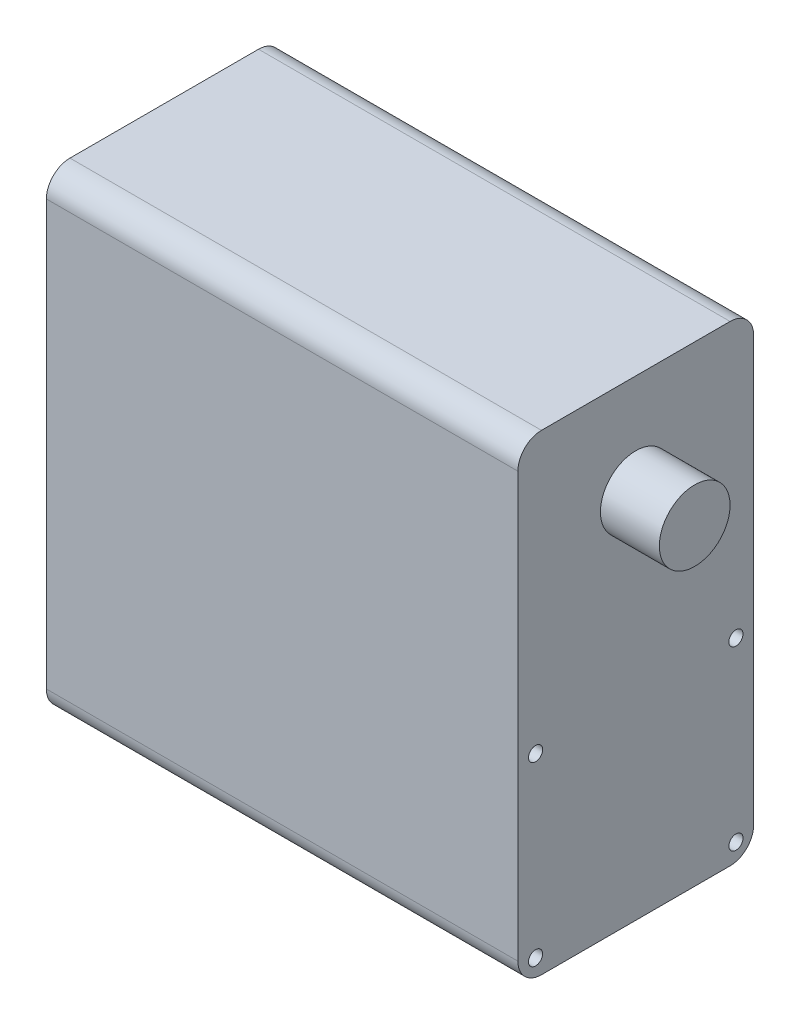
ISO-10303-21;
HEADER;
FILE_DESCRIPTION(('STEP AP214'),'2;1');
FILE_NAME('part.step','',(''),(''),'','','');
FILE_SCHEMA(('AUTOMOTIVE_DESIGN { 1 0 10303 214 1 1 1 1 }'));
ENDSEC;
DATA;
#1=APPLICATION_CONTEXT('core data for automotive mechanical design processes');
#2=APPLICATION_PROTOCOL_DEFINITION('international standard','automotive_design',2000,#1);
#3=PRODUCT_CONTEXT('',#1,'mechanical');
#4=PRODUCT('Part','Part','',(#3));
#5=PRODUCT_RELATED_PRODUCT_CATEGORY('part','',(#4));
#6=PRODUCT_DEFINITION_FORMATION('','',#4);
#7=PRODUCT_DEFINITION_CONTEXT('part definition',#1,'design');
#8=PRODUCT_DEFINITION('design','',#6,#7);
#9=PRODUCT_DEFINITION_SHAPE('','',#8);
#10=(LENGTH_UNIT() NAMED_UNIT(*) SI_UNIT(.MILLI.,.METRE.));
#11=(NAMED_UNIT(*) PLANE_ANGLE_UNIT() SI_UNIT($,.RADIAN.));
#12=(NAMED_UNIT(*) SI_UNIT($,.STERADIAN.) SOLID_ANGLE_UNIT());
#13=UNCERTAINTY_MEASURE_WITH_UNIT(LENGTH_MEASURE(1.E-05),#10,'distance_accuracy_value','');
#14=(GEOMETRIC_REPRESENTATION_CONTEXT(3) GLOBAL_UNCERTAINTY_ASSIGNED_CONTEXT((#13)) GLOBAL_UNIT_ASSIGNED_CONTEXT((#10,
#11,#12)) REPRESENTATION_CONTEXT('',''));
#15=CARTESIAN_POINT('',(0.,0.,0.));
#16=DIRECTION('',(0.,0.,1.));
#17=DIRECTION('',(1.,0.,0.));
#18=AXIS2_PLACEMENT_3D('',#15,#16,#17);
#19=CARTESIAN_POINT('',(0.,0.,0.));
#20=DIRECTION('',(1.,0.,0.));
#21=DIRECTION('',(0.,0.,-1.));
#22=AXIS2_PLACEMENT_3D('',#19,#20,#21);
#23=PLANE('',#22);
#24=CARTESIAN_POINT('',(0.,2.29906463085361,-10.4090018043815));
#25=DIRECTION('',(-1.,0.,0.));
#26=DIRECTION('',(0.,0.,1.));
#27=AXIS2_PLACEMENT_3D('',#24,#25,#26);
#28=CIRCLE('',#27,1.);
#29=CARTESIAN_POINT('',(0.,2.29906463085361,-9.4090018043815));
#30=VERTEX_POINT('',#29);
#31=EDGE_CURVE('E237',#30,#30,#28,.T.);
#32=ORIENTED_EDGE('',*,*,#31,.F.);
#33=EDGE_LOOP('',(#32));
#34=FACE_BOUND('',#33,.T.);
#35=CARTESIAN_POINT('',(0.,-10.7009353691464,-11.4090018043815));
#36=DIRECTION('',(-1.,0.,0.));
#37=DIRECTION('',(0.,0.,1.));
#38=AXIS2_PLACEMENT_3D('',#35,#36,#37);
#39=CIRCLE('',#38,1.);
#40=CARTESIAN_POINT('',(0.,-10.7009353691464,-10.4090018043815));
#41=VERTEX_POINT('',#40);
#42=EDGE_CURVE('E230',#41,#41,#39,.T.);
#43=ORIENTED_EDGE('',*,*,#42,.F.);
#44=EDGE_LOOP('',(#43));
#45=FACE_BOUND('',#44,.T.);
#46=CARTESIAN_POINT('',(0.,-17.2009353691464,-18.4090018043815));
#47=DIRECTION('',(-1.,0.,0.));
#48=DIRECTION('',(0.,0.,1.));
#49=AXIS2_PLACEMENT_3D('',#46,#47,#48);
#50=CIRCLE('',#49,1.);
#51=CARTESIAN_POINT('',(0.,-17.2009353691464,-17.4090018043815));
#52=VERTEX_POINT('',#51);
#53=EDGE_CURVE('E254',#52,#52,#50,.T.);
#54=ORIENTED_EDGE('',*,*,#53,.F.);
#55=EDGE_LOOP('',(#54));
#56=FACE_BOUND('',#55,.T.);
#57=CARTESIAN_POINT('',(0.,-13.7009353691464,-11.4090018043815));
#58=DIRECTION('',(-1.,0.,0.));
#59=DIRECTION('',(0.,0.,1.));
#60=AXIS2_PLACEMENT_3D('',#57,#58,#59);
#61=CIRCLE('',#60,1.);
#62=CARTESIAN_POINT('',(0.,-13.7009353691464,-10.4090018043815));
#63=VERTEX_POINT('',#62);
#64=EDGE_CURVE('E221',#63,#63,#61,.T.);
#65=ORIENTED_EDGE('',*,*,#64,.F.);
#66=EDGE_LOOP('',(#65));
#67=FACE_BOUND('',#66,.T.);
#68=CARTESIAN_POINT('',(0.,11.2990646308536,-18.4090018043815));
#69=DIRECTION('',(1.,0.,0.));
#70=DIRECTION('',(0.,0.,-1.));
#71=AXIS2_PLACEMENT_3D('',#68,#69,#70);
#72=CIRCLE('',#71,3.);
#73=CARTESIAN_POINT('',(0.,11.2990646308536,-21.4090018043815));
#74=VERTEX_POINT('',#73);
#75=EDGE_CURVE('E139',#74,#74,#72,.T.);
#76=ORIENTED_EDGE('',*,*,#75,.T.);
#77=EDGE_LOOP('',(#76));
#78=FACE_BOUND('',#77,.T.);
#79=DIRECTION('',(0.,1.,0.));
#80=VECTOR('',#79,1.);
#81=CARTESIAN_POINT('',(0.,19.7990646308536,-28.4090018043815));
#82=LINE('',#81,#80);
#83=CARTESIAN_POINT('',(0.,-18.2009353691464,-28.4090018043815));
#84=VERTEX_POINT('',#83);
#85=CARTESIAN_POINT('',(0.,17.7990646308536,-28.4090018043815));
#86=VERTEX_POINT('',#85);
#87=EDGE_CURVE('E122',#84,#86,#82,.T.);
#88=ORIENTED_EDGE('',*,*,#87,.F.);
#89=CARTESIAN_POINT('',(0.,-18.2009353691464,-26.4090018043815));
#90=DIRECTION('',(1.,0.,0.));
#91=DIRECTION('',(0.,0.,-1.));
#92=AXIS2_PLACEMENT_3D('',#89,#90,#91);
#93=CIRCLE('',#92,2.);
#94=CARTESIAN_POINT('',(0.,-20.2009353691464,-26.4090018043815));
#95=VERTEX_POINT('',#94);
#96=EDGE_CURVE('E105',#84,#95,#93,.F.);
#97=ORIENTED_EDGE('',*,*,#96,.T.);
#98=DIRECTION('',(0.,0.,-1.));
#99=VECTOR('',#98,1.);
#100=CARTESIAN_POINT('',(0.,-20.2009353691464,-8.40900180438151));
#101=LINE('',#100,#99);
#102=CARTESIAN_POINT('',(0.,-20.2009353691464,-10.4090018043815));
#103=VERTEX_POINT('',#102);
#104=EDGE_CURVE('E131',#103,#95,#101,.T.);
#105=ORIENTED_EDGE('',*,*,#104,.F.);
#106=CARTESIAN_POINT('',(0.,-18.2009353691464,-10.4090018043815));
#107=DIRECTION('',(1.,0.,0.));
#108=DIRECTION('',(0.,0.,-1.));
#109=AXIS2_PLACEMENT_3D('',#106,#107,#108);
#110=CIRCLE('',#109,2.);
#111=CARTESIAN_POINT('',(0.,-18.2009353691464,-8.40900180438151));
#112=VERTEX_POINT('',#111);
#113=EDGE_CURVE('E116',#103,#112,#110,.F.);
#114=ORIENTED_EDGE('',*,*,#113,.T.);
#115=DIRECTION('',(0.,-1.,0.));
#116=VECTOR('',#115,1.);
#117=CARTESIAN_POINT('',(0.,19.7990646308536,-8.4090018043815));
#118=LINE('',#117,#116);
#119=CARTESIAN_POINT('',(0.,17.7990646308536,-8.4090018043815));
#120=VERTEX_POINT('',#119);
#121=EDGE_CURVE('E135',#120,#112,#118,.T.);
#122=ORIENTED_EDGE('',*,*,#121,.F.);
#123=CARTESIAN_POINT('',(0.,17.7990646308536,-10.4090018043815));
#124=DIRECTION('',(1.,0.,0.));
#125=DIRECTION('',(0.,0.,-1.));
#126=AXIS2_PLACEMENT_3D('',#123,#124,#125);
#127=CIRCLE('',#126,2.);
#128=CARTESIAN_POINT('',(0.,19.7990646308536,-10.4090018043815));
#129=VERTEX_POINT('',#128);
#130=EDGE_CURVE('E147',#120,#129,#127,.F.);
#131=ORIENTED_EDGE('',*,*,#130,.T.);
#132=DIRECTION('',(0.,0.,1.));
#133=VECTOR('',#132,1.);
#134=CARTESIAN_POINT('',(0.,19.7990646308536,-8.4090018043815));
#135=LINE('',#134,#133);
#136=CARTESIAN_POINT('',(0.,19.7990646308536,-26.4090018043815));
#137=VERTEX_POINT('',#136);
#138=EDGE_CURVE('E130',#137,#129,#135,.T.);
#139=ORIENTED_EDGE('',*,*,#138,.F.);
#140=CARTESIAN_POINT('',(0.,17.7990646308536,-26.4090018043815));
#141=DIRECTION('',(1.,0.,0.));
#142=DIRECTION('',(0.,0.,-1.));
#143=AXIS2_PLACEMENT_3D('',#140,#141,#142);
#144=CIRCLE('',#143,2.);
#145=EDGE_CURVE('E125',#137,#86,#144,.F.);
#146=ORIENTED_EDGE('',*,*,#145,.T.);
#147=EDGE_LOOP('',(#88,#97,#105,#114,#122,#131,#139,#146));
#148=FACE_BOUND('',#147,.T.);
#149=CARTESIAN_POINT('',(0.,-10.7009353691464,-25.4090018043815));
#150=DIRECTION('',(1.,0.,0.));
#151=DIRECTION('',(0.,0.,-1.));
#152=AXIS2_PLACEMENT_3D('',#149,#150,#151);
#153=CIRCLE('',#152,1.);
#154=CARTESIAN_POINT('',(0.,-10.7009353691464,-26.4090018043815));
#155=VERTEX_POINT('',#154);
#156=EDGE_CURVE('E231',#155,#155,#153,.T.);
#157=ORIENTED_EDGE('',*,*,#156,.T.);
#158=EDGE_LOOP('',(#157));
#159=FACE_BOUND('',#158,.T.);
#160=CARTESIAN_POINT('',(0.,2.29906463085361,-26.4090018043815));
#161=DIRECTION('',(1.,0.,0.));
#162=DIRECTION('',(0.,0.,-1.));
#163=AXIS2_PLACEMENT_3D('',#160,#161,#162);
#164=CIRCLE('',#163,1.);
#165=CARTESIAN_POINT('',(0.,2.29906463085361,-27.4090018043815));
#166=VERTEX_POINT('',#165);
#167=EDGE_CURVE('E243',#166,#166,#164,.T.);
#168=ORIENTED_EDGE('',*,*,#167,.T.);
#169=EDGE_LOOP('',(#168));
#170=FACE_BOUND('',#169,.T.);
#171=CARTESIAN_POINT('',(0.,-13.7009353691464,-25.4090018043815));
#172=DIRECTION('',(-1.,0.,0.));
#173=DIRECTION('',(0.,0.,1.));
#174=AXIS2_PLACEMENT_3D('',#171,#172,#173);
#175=CIRCLE('',#174,1.);
#176=CARTESIAN_POINT('',(0.,-13.7009353691464,-24.4090018043815));
#177=VERTEX_POINT('',#176);
#178=EDGE_CURVE('E224',#177,#177,#175,.F.);
#179=ORIENTED_EDGE('',*,*,#178,.T.);
#180=EDGE_LOOP('',(#179));
#181=FACE_BOUND('',#180,.T.);
#182=ADVANCED_FACE('F40',(#34,#45,#56,#67,#78,#148,#159,#170,#181),#23,.F.);
#183=CARTESIAN_POINT('',(40.,0.,0.));
#184=DIRECTION('',(1.,0.,0.));
#185=DIRECTION('',(0.,0.,-1.));
#186=AXIS2_PLACEMENT_3D('',#183,#184,#185);
#187=PLANE('',#186);
#188=CARTESIAN_POINT('',(40.,11.2990646308536,-18.4090018043815));
#189=DIRECTION('',(1.,0.,0.));
#190=DIRECTION('',(0.,0.,-1.));
#191=AXIS2_PLACEMENT_3D('',#188,#189,#190);
#192=CIRCLE('',#191,3.);
#193=CARTESIAN_POINT('',(40.,11.2990646308536,-21.4090018043815));
#194=VERTEX_POINT('',#193);
#195=EDGE_CURVE('E144',#194,#194,#192,.T.);
#196=ORIENTED_EDGE('',*,*,#195,.F.);
#197=EDGE_LOOP('',(#196));
#198=FACE_BOUND('',#197,.T.);
#199=CARTESIAN_POINT('',(40.,-3.70093536914638,-9.90900180438151));
#200=DIRECTION('',(-1.,0.,0.));
#201=DIRECTION('',(0.,0.,1.));
#202=AXIS2_PLACEMENT_3D('',#199,#200,#201);
#203=CIRCLE('',#202,0.6);
#204=CARTESIAN_POINT('',(40.,-3.70093536914638,-9.30900180438151));
#205=VERTEX_POINT('',#204);
#206=EDGE_CURVE('E205',#205,#205,#203,.T.);
#207=ORIENTED_EDGE('',*,*,#206,.T.);
#208=EDGE_LOOP('',(#207));
#209=FACE_BOUND('',#208,.T.);
#210=CARTESIAN_POINT('',(40.,-3.70093536914638,-26.9090018043815));
#211=DIRECTION('',(1.,0.,0.));
#212=DIRECTION('',(0.,0.,-1.));
#213=AXIS2_PLACEMENT_3D('',#210,#211,#212);
#214=CIRCLE('',#213,0.6);
#215=CARTESIAN_POINT('',(40.,-3.70093536914638,-27.5090018043815));
#216=VERTEX_POINT('',#215);
#217=EDGE_CURVE('E195',#216,#216,#214,.T.);
#218=ORIENTED_EDGE('',*,*,#217,.F.);
#219=EDGE_LOOP('',(#218));
#220=FACE_BOUND('',#219,.T.);
#221=CARTESIAN_POINT('',(40.,-18.7009353691464,-26.9090018043815));
#222=DIRECTION('',(1.,0.,0.));
#223=DIRECTION('',(0.,0.,-1.));
#224=AXIS2_PLACEMENT_3D('',#221,#222,#223);
#225=CIRCLE('',#224,0.6);
#226=CARTESIAN_POINT('',(40.,-18.7009353691464,-27.5090018043815));
#227=VERTEX_POINT('',#226);
#228=EDGE_CURVE('E186',#227,#227,#225,.T.);
#229=ORIENTED_EDGE('',*,*,#228,.F.);
#230=EDGE_LOOP('',(#229));
#231=FACE_BOUND('',#230,.T.);
#232=DIRECTION('',(0.,0.,-1.));
#233=VECTOR('',#232,1.);
#234=CARTESIAN_POINT('',(40.,-20.2009353691464,-8.40900180438151));
#235=LINE('',#234,#233);
#236=CARTESIAN_POINT('',(40.,-20.2009353691464,-10.4090018043815));
#237=VERTEX_POINT('',#236);
#238=CARTESIAN_POINT('',(40.,-20.2009353691464,-26.4090018043815));
#239=VERTEX_POINT('',#238);
#240=EDGE_CURVE('E181',#237,#239,#235,.T.);
#241=ORIENTED_EDGE('',*,*,#240,.T.);
#242=CARTESIAN_POINT('',(40.,-18.2009353691464,-26.4090018043815));
#243=DIRECTION('',(1.,0.,0.));
#244=DIRECTION('',(0.,0.,-1.));
#245=AXIS2_PLACEMENT_3D('',#242,#243,#244);
#246=CIRCLE('',#245,2.);
#247=CARTESIAN_POINT('',(40.,-18.2009353691464,-28.4090018043815));
#248=VERTEX_POINT('',#247);
#249=EDGE_CURVE('E158',#239,#248,#246,.T.);
#250=ORIENTED_EDGE('',*,*,#249,.T.);
#251=DIRECTION('',(0.,1.,0.));
#252=VECTOR('',#251,1.);
#253=CARTESIAN_POINT('',(40.,19.7990646308536,-28.4090018043815));
#254=LINE('',#253,#252);
#255=CARTESIAN_POINT('',(40.,17.7990646308536,-28.4090018043815));
#256=VERTEX_POINT('',#255);
#257=EDGE_CURVE('E124',#248,#256,#254,.T.);
#258=ORIENTED_EDGE('',*,*,#257,.T.);
#259=CARTESIAN_POINT('',(40.,17.7990646308536,-26.4090018043815));
#260=DIRECTION('',(1.,0.,0.));
#261=DIRECTION('',(0.,0.,-1.));
#262=AXIS2_PLACEMENT_3D('',#259,#260,#261);
#263=CIRCLE('',#262,2.);
#264=CARTESIAN_POINT('',(40.,19.7990646308536,-26.4090018043815));
#265=VERTEX_POINT('',#264);
#266=EDGE_CURVE('E60',#256,#265,#263,.T.);
#267=ORIENTED_EDGE('',*,*,#266,.T.);
#268=DIRECTION('',(0.,0.,1.));
#269=VECTOR('',#268,1.);
#270=CARTESIAN_POINT('',(40.,19.7990646308536,-8.4090018043815));
#271=LINE('',#270,#269);
#272=CARTESIAN_POINT('',(40.,19.7990646308536,-10.4090018043815));
#273=VERTEX_POINT('',#272);
#274=EDGE_CURVE('E167',#265,#273,#271,.T.);
#275=ORIENTED_EDGE('',*,*,#274,.T.);
#276=CARTESIAN_POINT('',(40.,17.7990646308536,-10.4090018043815));
#277=DIRECTION('',(1.,0.,0.));
#278=DIRECTION('',(0.,0.,-1.));
#279=AXIS2_PLACEMENT_3D('',#276,#277,#278);
#280=CIRCLE('',#279,2.);
#281=CARTESIAN_POINT('',(40.,17.7990646308536,-8.4090018043815));
#282=VERTEX_POINT('',#281);
#283=EDGE_CURVE('E154',#273,#282,#280,.T.);
#284=ORIENTED_EDGE('',*,*,#283,.T.);
#285=DIRECTION('',(0.,-1.,0.));
#286=VECTOR('',#285,1.);
#287=CARTESIAN_POINT('',(40.,19.7990646308536,-8.4090018043815));
#288=LINE('',#287,#286);
#289=CARTESIAN_POINT('',(40.,-18.2009353691464,-8.40900180438151));
#290=VERTEX_POINT('',#289);
#291=EDGE_CURVE('E133',#282,#290,#288,.T.);
#292=ORIENTED_EDGE('',*,*,#291,.T.);
#293=CARTESIAN_POINT('',(40.,-18.2009353691464,-10.4090018043815));
#294=DIRECTION('',(1.,0.,0.));
#295=DIRECTION('',(0.,0.,-1.));
#296=AXIS2_PLACEMENT_3D('',#293,#294,#295);
#297=CIRCLE('',#296,2.);
#298=EDGE_CURVE('E156',#290,#237,#297,.T.);
#299=ORIENTED_EDGE('',*,*,#298,.T.);
#300=EDGE_LOOP('',(#241,#250,#258,#267,#275,#284,#292,#299));
#301=FACE_BOUND('',#300,.T.);
#302=CARTESIAN_POINT('',(40.,-18.7009353691464,-9.90900180438151));
#303=DIRECTION('',(-1.,0.,0.));
#304=DIRECTION('',(0.,0.,1.));
#305=AXIS2_PLACEMENT_3D('',#302,#303,#304);
#306=CIRCLE('',#305,0.6);
#307=CARTESIAN_POINT('',(40.,-18.7009353691464,-9.30900180438151));
#308=VERTEX_POINT('',#307);
#309=EDGE_CURVE('E199',#308,#308,#306,.T.);
#310=ORIENTED_EDGE('',*,*,#309,.T.);
#311=EDGE_LOOP('',(#310));
#312=FACE_BOUND('',#311,.T.);
#313=ADVANCED_FACE('F281',(#198,#209,#220,#231,#301,#312),#187,.T.);
#314=CARTESIAN_POINT('',(40.,19.7990646308536,-8.4090018043815));
#315=DIRECTION('',(0.,0.,-1.));
#316=DIRECTION('',(0.,1.,0.));
#317=AXIS2_PLACEMENT_3D('',#314,#315,#316);
#318=PLANE('',#317);
#319=ORIENTED_EDGE('',*,*,#121,.T.);
#320=DIRECTION('',(-1.,0.,0.));
#321=VECTOR('',#320,1.);
#322=CARTESIAN_POINT('',(40.,-18.2009353691464,-8.40900180438151));
#323=LINE('',#322,#321);
#324=EDGE_CURVE('E163',#112,#290,#323,.F.);
#325=ORIENTED_EDGE('',*,*,#324,.T.);
#326=ORIENTED_EDGE('',*,*,#291,.F.);
#327=DIRECTION('',(-1.,0.,0.));
#328=VECTOR('',#327,1.);
#329=CARTESIAN_POINT('',(40.,17.7990646308536,-8.4090018043815));
#330=LINE('',#329,#328);
#331=EDGE_CURVE('E160',#282,#120,#330,.T.);
#332=ORIENTED_EDGE('',*,*,#331,.T.);
#333=EDGE_LOOP('',(#319,#325,#326,#332));
#334=FACE_BOUND('',#333,.T.);
#335=ADVANCED_FACE('F177',(#334),#318,.F.);
#336=CARTESIAN_POINT('',(40.,-20.2009353691464,-8.40900180438151));
#337=DIRECTION('',(0.,1.,0.));
#338=DIRECTION('',(0.,0.,1.));
#339=AXIS2_PLACEMENT_3D('',#336,#337,#338);
#340=PLANE('',#339);
#341=ORIENTED_EDGE('',*,*,#104,.T.);
#342=DIRECTION('',(-1.,0.,0.));
#343=VECTOR('',#342,1.);
#344=CARTESIAN_POINT('',(40.,-20.2009353691464,-26.4090018043815));
#345=LINE('',#344,#343);
#346=EDGE_CURVE('E110',#95,#239,#345,.F.);
#347=ORIENTED_EDGE('',*,*,#346,.T.);
#348=ORIENTED_EDGE('',*,*,#240,.F.);
#349=DIRECTION('',(-1.,0.,0.));
#350=VECTOR('',#349,1.);
#351=CARTESIAN_POINT('',(40.,-20.2009353691464,-10.4090018043815));
#352=LINE('',#351,#350);
#353=EDGE_CURVE('E115',#237,#103,#352,.T.);
#354=ORIENTED_EDGE('',*,*,#353,.T.);
#355=EDGE_LOOP('',(#341,#347,#348,#354));
#356=FACE_BOUND('',#355,.T.);
#357=ADVANCED_FACE('F299',(#356),#340,.F.);
#358=CARTESIAN_POINT('',(40.,19.7990646308536,-28.4090018043815));
#359=DIRECTION('',(0.,0.,1.));
#360=DIRECTION('',(0.,-1.,0.));
#361=AXIS2_PLACEMENT_3D('',#358,#359,#360);
#362=PLANE('',#361);
#363=ORIENTED_EDGE('',*,*,#257,.F.);
#364=DIRECTION('',(-1.,0.,0.));
#365=VECTOR('',#364,1.);
#366=CARTESIAN_POINT('',(40.,-18.2009353691464,-28.4090018043815));
#367=LINE('',#366,#365);
#368=EDGE_CURVE('E109',#248,#84,#367,.T.);
#369=ORIENTED_EDGE('',*,*,#368,.T.);
#370=ORIENTED_EDGE('',*,*,#87,.T.);
#371=DIRECTION('',(-1.,0.,0.));
#372=VECTOR('',#371,1.);
#373=CARTESIAN_POINT('',(40.,17.7990646308536,-28.4090018043815));
#374=LINE('',#373,#372);
#375=EDGE_CURVE('E126',#86,#256,#374,.F.);
#376=ORIENTED_EDGE('',*,*,#375,.T.);
#377=EDGE_LOOP('',(#363,#369,#370,#376));
#378=FACE_BOUND('',#377,.T.);
#379=ADVANCED_FACE('F121',(#378),#362,.F.);
#380=CARTESIAN_POINT('',(40.,19.7990646308536,-8.4090018043815));
#381=DIRECTION('',(0.,-1.,0.));
#382=DIRECTION('',(0.,0.,-1.));
#383=AXIS2_PLACEMENT_3D('',#380,#381,#382);
#384=PLANE('',#383);
#385=ORIENTED_EDGE('',*,*,#138,.T.);
#386=DIRECTION('',(-1.,0.,0.));
#387=VECTOR('',#386,1.);
#388=CARTESIAN_POINT('',(40.,19.7990646308536,-10.4090018043815));
#389=LINE('',#388,#387);
#390=EDGE_CURVE('E11',#129,#273,#389,.F.);
#391=ORIENTED_EDGE('',*,*,#390,.T.);
#392=ORIENTED_EDGE('',*,*,#274,.F.);
#393=DIRECTION('',(-1.,0.,0.));
#394=VECTOR('',#393,1.);
#395=CARTESIAN_POINT('',(40.,19.7990646308536,-26.4090018043815));
#396=LINE('',#395,#394);
#397=EDGE_CURVE('E48',#265,#137,#396,.T.);
#398=ORIENTED_EDGE('',*,*,#397,.T.);
#399=EDGE_LOOP('',(#385,#391,#392,#398));
#400=FACE_BOUND('',#399,.T.);
#401=ADVANCED_FACE('F166',(#400),#384,.F.);
#402=CARTESIAN_POINT('',(35.,-18.7009353691464,-26.9090018043815));
#403=DIRECTION('',(1.,0.,0.));
#404=DIRECTION('',(0.,0.,-1.));
#405=AXIS2_PLACEMENT_3D('',#402,#403,#404);
#406=CYLINDRICAL_SURFACE('',#405,0.6);
#407=CARTESIAN_POINT('',(35.,-18.7009353691464,-26.9090018043815));
#408=DIRECTION('',(1.,0.,0.));
#409=DIRECTION('',(0.,0.,-1.));
#410=AXIS2_PLACEMENT_3D('',#407,#408,#409);
#411=CIRCLE('',#410,0.6);
#412=CARTESIAN_POINT('',(35.,-18.7009353691464,-27.5090018043815));
#413=VERTEX_POINT('',#412);
#414=EDGE_CURVE('E190',#413,#413,#411,.T.);
#415=ORIENTED_EDGE('',*,*,#414,.F.);
#416=EDGE_LOOP('',(#415));
#417=FACE_BOUND('',#416,.T.);
#418=ORIENTED_EDGE('',*,*,#228,.T.);
#419=EDGE_LOOP('',(#418));
#420=FACE_BOUND('',#419,.T.);
#421=ADVANCED_FACE('F296',(#417,#420),#406,.F.);
#422=CARTESIAN_POINT('',(35.,-18.7009353691464,-26.9090018043815));
#423=DIRECTION('',(1.,0.,0.));
#424=DIRECTION('',(0.,0.,-1.));
#425=AXIS2_PLACEMENT_3D('',#422,#423,#424);
#426=PLANE('',#425);
#427=ORIENTED_EDGE('',*,*,#414,.T.);
#428=EDGE_LOOP('',(#427));
#429=FACE_BOUND('',#428,.T.);
#430=ADVANCED_FACE('F340',(#429),#426,.T.);
#431=CARTESIAN_POINT('',(35.,-3.70093536914638,-26.9090018043815));
#432=DIRECTION('',(1.,0.,0.));
#433=DIRECTION('',(0.,0.,-1.));
#434=AXIS2_PLACEMENT_3D('',#431,#432,#433);
#435=CYLINDRICAL_SURFACE('',#434,0.6);
#436=CARTESIAN_POINT('',(35.,-3.70093536914638,-26.9090018043815));
#437=DIRECTION('',(1.,0.,0.));
#438=DIRECTION('',(0.,0.,-1.));
#439=AXIS2_PLACEMENT_3D('',#436,#437,#438);
#440=CIRCLE('',#439,0.6);
#441=CARTESIAN_POINT('',(35.,-3.70093536914638,-27.5090018043815));
#442=VERTEX_POINT('',#441);
#443=EDGE_CURVE('E208',#442,#442,#440,.T.);
#444=ORIENTED_EDGE('',*,*,#443,.F.);
#445=EDGE_LOOP('',(#444));
#446=FACE_BOUND('',#445,.T.);
#447=ORIENTED_EDGE('',*,*,#217,.T.);
#448=EDGE_LOOP('',(#447));
#449=FACE_BOUND('',#448,.T.);
#450=ADVANCED_FACE('F342',(#446,#449),#435,.F.);
#451=CARTESIAN_POINT('',(35.,-3.70093536914638,-26.9090018043815));
#452=DIRECTION('',(1.,0.,0.));
#453=DIRECTION('',(0.,0.,-1.));
#454=AXIS2_PLACEMENT_3D('',#451,#452,#453);
#455=PLANE('',#454);
#456=ORIENTED_EDGE('',*,*,#443,.T.);
#457=EDGE_LOOP('',(#456));
#458=FACE_BOUND('',#457,.T.);
#459=ADVANCED_FACE('F365',(#458),#455,.T.);
#460=CARTESIAN_POINT('',(35.,-3.70093536914638,-9.90900180438151));
#461=DIRECTION('',(1.,0.,0.));
#462=DIRECTION('',(0.,0.,-1.));
#463=AXIS2_PLACEMENT_3D('',#460,#461,#462);
#464=CYLINDRICAL_SURFACE('',#463,0.6);
#465=CARTESIAN_POINT('',(35.,-3.70093536914638,-9.90900180438151));
#466=DIRECTION('',(-1.,0.,0.));
#467=DIRECTION('',(0.,0.,1.));
#468=AXIS2_PLACEMENT_3D('',#465,#466,#467);
#469=CIRCLE('',#468,0.6);
#470=CARTESIAN_POINT('',(35.,-3.70093536914638,-9.30900180438151));
#471=VERTEX_POINT('',#470);
#472=EDGE_CURVE('E202',#471,#471,#469,.T.);
#473=ORIENTED_EDGE('',*,*,#472,.T.);
#474=EDGE_LOOP('',(#473));
#475=FACE_BOUND('',#474,.T.);
#476=ORIENTED_EDGE('',*,*,#206,.F.);
#477=EDGE_LOOP('',(#476));
#478=FACE_BOUND('',#477,.T.);
#479=ADVANCED_FACE('F335',(#475,#478),#464,.F.);
#480=CARTESIAN_POINT('',(35.,-3.70093536914638,-9.90900180438151));
#481=DIRECTION('',(-1.,0.,0.));
#482=DIRECTION('',(0.,0.,1.));
#483=AXIS2_PLACEMENT_3D('',#480,#481,#482);
#484=PLANE('',#483);
#485=ORIENTED_EDGE('',*,*,#472,.F.);
#486=EDGE_LOOP('',(#485));
#487=FACE_BOUND('',#486,.T.);
#488=ADVANCED_FACE('F325',(#487),#484,.F.);
#489=CARTESIAN_POINT('',(35.,-18.7009353691464,-9.90900180438151));
#490=DIRECTION('',(1.,0.,0.));
#491=DIRECTION('',(0.,0.,-1.));
#492=AXIS2_PLACEMENT_3D('',#489,#490,#491);
#493=CYLINDRICAL_SURFACE('',#492,0.6);
#494=CARTESIAN_POINT('',(35.,-18.7009353691464,-9.90900180438151));
#495=DIRECTION('',(-1.,0.,0.));
#496=DIRECTION('',(0.,0.,1.));
#497=AXIS2_PLACEMENT_3D('',#494,#495,#496);
#498=CIRCLE('',#497,0.6);
#499=CARTESIAN_POINT('',(35.,-18.7009353691464,-9.30900180438151));
#500=VERTEX_POINT('',#499);
#501=EDGE_CURVE('E142',#500,#500,#498,.T.);
#502=ORIENTED_EDGE('',*,*,#501,.T.);
#503=EDGE_LOOP('',(#502));
#504=FACE_BOUND('',#503,.T.);
#505=ORIENTED_EDGE('',*,*,#309,.F.);
#506=EDGE_LOOP('',(#505));
#507=FACE_BOUND('',#506,.T.);
#508=ADVANCED_FACE('F322',(#504,#507),#493,.F.);
#509=CARTESIAN_POINT('',(35.,-18.7009353691464,-9.90900180438151));
#510=DIRECTION('',(-1.,0.,0.));
#511=DIRECTION('',(0.,0.,1.));
#512=AXIS2_PLACEMENT_3D('',#509,#510,#511);
#513=PLANE('',#512);
#514=ORIENTED_EDGE('',*,*,#501,.F.);
#515=EDGE_LOOP('',(#514));
#516=FACE_BOUND('',#515,.T.);
#517=ADVANCED_FACE('F324',(#516),#513,.F.);
#518=CARTESIAN_POINT('',(-5.,0.,0.));
#519=DIRECTION('',(1.,0.,0.));
#520=DIRECTION('',(0.,0.,-1.));
#521=AXIS2_PLACEMENT_3D('',#518,#519,#520);
#522=PLANE('',#521);
#523=CARTESIAN_POINT('',(-5.,11.2990646308536,-18.4090018043815));
#524=DIRECTION('',(1.,0.,0.));
#525=DIRECTION('',(0.,0.,-1.));
#526=AXIS2_PLACEMENT_3D('',#523,#524,#525);
#527=CIRCLE('',#526,3.);
#528=CARTESIAN_POINT('',(-5.,11.2990646308536,-21.4090018043815));
#529=VERTEX_POINT('',#528);
#530=EDGE_CURVE('E143',#529,#529,#527,.T.);
#531=ORIENTED_EDGE('',*,*,#530,.F.);
#532=EDGE_LOOP('',(#531));
#533=FACE_BOUND('',#532,.T.);
#534=ADVANCED_FACE('F332',(#533),#522,.F.);
#535=CARTESIAN_POINT('',(-5.,11.2990646308536,-18.4090018043815));
#536=DIRECTION('',(1.,0.,0.));
#537=DIRECTION('',(0.,0.,-1.));
#538=AXIS2_PLACEMENT_3D('',#535,#536,#537);
#539=CYLINDRICAL_SURFACE('',#538,3.);
#540=CARTESIAN_POINT('',(-5.,11.2990646308536,-21.4090018043815));
#541=CARTESIAN_POINT('',(-4.94791666666666,11.2990646308536,-21.4090018043815));
#542=CARTESIAN_POINT('',(-4.89583333333333,11.2990646308536,-21.4090018043815));
#543=CARTESIAN_POINT('',(-4.79166666666666,11.2990646308536,-21.4090018043815));
#544=CARTESIAN_POINT('',(-4.73958333333333,11.2990646308536,-21.4090018043815));
#545=CARTESIAN_POINT('',(-4.63541666666666,11.2990646308536,-21.4090018043815));
#546=CARTESIAN_POINT('',(-4.58333333333333,11.2990646308536,-21.4090018043815));
#547=CARTESIAN_POINT('',(-4.47916666666667,11.2990646308536,-21.4090018043815));
#548=CARTESIAN_POINT('',(-4.42708333333333,11.2990646308536,-21.4090018043815));
#549=CARTESIAN_POINT('',(-4.32291666666667,11.2990646308536,-21.4090018043815));
#550=CARTESIAN_POINT('',(-4.27083333333333,11.2990646308536,-21.4090018043815));
#551=CARTESIAN_POINT('',(-4.16666666666667,11.2990646308536,-21.4090018043815));
#552=CARTESIAN_POINT('',(-4.11458333333333,11.2990646308536,-21.4090018043815));
#553=CARTESIAN_POINT('',(-4.01041666666667,11.2990646308536,-21.4090018043815));
#554=CARTESIAN_POINT('',(-3.95833333333333,11.2990646308536,-21.4090018043815));
#555=CARTESIAN_POINT('',(-3.85416666666667,11.2990646308536,-21.4090018043815));
#556=CARTESIAN_POINT('',(-3.80208333333333,11.2990646308536,-21.4090018043815));
#557=CARTESIAN_POINT('',(-3.69791666666667,11.2990646308536,-21.4090018043815));
#558=CARTESIAN_POINT('',(-3.64583333333333,11.2990646308536,-21.4090018043815));
#559=CARTESIAN_POINT('',(-3.54166666666667,11.2990646308536,-21.4090018043815));
#560=CARTESIAN_POINT('',(-3.48958333333333,11.2990646308536,-21.4090018043815));
#561=CARTESIAN_POINT('',(-3.38541666666667,11.2990646308536,-21.4090018043815));
#562=CARTESIAN_POINT('',(-3.33333333333333,11.2990646308536,-21.4090018043815));
#563=CARTESIAN_POINT('',(-3.22916666666667,11.2990646308536,-21.4090018043815));
#564=CARTESIAN_POINT('',(-3.17708333333333,11.2990646308536,-21.4090018043815));
#565=CARTESIAN_POINT('',(-3.07291666666667,11.2990646308536,-21.4090018043815));
#566=CARTESIAN_POINT('',(-3.02083333333333,11.2990646308536,-21.4090018043815));
#567=CARTESIAN_POINT('',(-2.91666666666667,11.2990646308536,-21.4090018043815));
#568=CARTESIAN_POINT('',(-2.86458333333333,11.2990646308536,-21.4090018043815));
#569=CARTESIAN_POINT('',(-2.76041666666667,11.2990646308536,-21.4090018043815));
#570=CARTESIAN_POINT('',(-2.70833333333333,11.2990646308536,-21.4090018043815));
#571=CARTESIAN_POINT('',(-2.60416666666667,11.2990646308536,-21.4090018043815));
#572=CARTESIAN_POINT('',(-2.55208333333333,11.2990646308536,-21.4090018043815));
#573=CARTESIAN_POINT('',(-2.44791666666667,11.2990646308536,-21.4090018043815));
#574=CARTESIAN_POINT('',(-2.39583333333333,11.2990646308536,-21.4090018043815));
#575=CARTESIAN_POINT('',(-2.29166666666667,11.2990646308536,-21.4090018043815));
#576=CARTESIAN_POINT('',(-2.23958333333333,11.2990646308536,-21.4090018043815));
#577=CARTESIAN_POINT('',(-2.13541666666667,11.2990646308536,-21.4090018043815));
#578=CARTESIAN_POINT('',(-2.08333333333333,11.2990646308536,-21.4090018043815));
#579=CARTESIAN_POINT('',(-1.97916666666667,11.2990646308536,-21.4090018043815));
#580=CARTESIAN_POINT('',(-1.92708333333333,11.2990646308536,-21.4090018043815));
#581=CARTESIAN_POINT('',(-1.82291666666667,11.2990646308536,-21.4090018043815));
#582=CARTESIAN_POINT('',(-1.77083333333333,11.2990646308536,-21.4090018043815));
#583=CARTESIAN_POINT('',(-1.66666666666667,11.2990646308536,-21.4090018043815));
#584=CARTESIAN_POINT('',(-1.61458333333333,11.2990646308536,-21.4090018043815));
#585=CARTESIAN_POINT('',(-1.51041666666667,11.2990646308536,-21.4090018043815));
#586=CARTESIAN_POINT('',(-1.45833333333333,11.2990646308536,-21.4090018043815));
#587=CARTESIAN_POINT('',(-1.35416666666667,11.2990646308536,-21.4090018043815));
#588=CARTESIAN_POINT('',(-1.30208333333333,11.2990646308536,-21.4090018043815));
#589=CARTESIAN_POINT('',(-1.19791666666667,11.2990646308536,-21.4090018043815));
#590=CARTESIAN_POINT('',(-1.14583333333333,11.2990646308536,-21.4090018043815));
#591=CARTESIAN_POINT('',(-1.04166666666667,11.2990646308536,-21.4090018043815));
#592=CARTESIAN_POINT('',(-0.989583333333333,11.2990646308536,-21.4090018043815));
#593=CARTESIAN_POINT('',(-0.885416666666667,11.2990646308536,-21.4090018043815));
#594=CARTESIAN_POINT('',(-0.833333333333334,11.2990646308536,-21.4090018043815));
#595=CARTESIAN_POINT('',(-0.729166666666667,11.2990646308536,-21.4090018043815));
#596=CARTESIAN_POINT('',(-0.677083333333334,11.2990646308536,-21.4090018043815));
#597=CARTESIAN_POINT('',(-0.572916666666667,11.2990646308536,-21.4090018043815));
#598=CARTESIAN_POINT('',(-0.520833333333334,11.2990646308536,-21.4090018043815));
#599=CARTESIAN_POINT('',(-0.416666666666667,11.2990646308536,-21.4090018043815));
#600=CARTESIAN_POINT('',(-0.364583333333334,11.2990646308536,-21.4090018043815));
#601=CARTESIAN_POINT('',(-0.260416666666668,11.2990646308536,-21.4090018043815));
#602=CARTESIAN_POINT('',(-0.208333333333334,11.2990646308536,-21.4090018043815));
#603=CARTESIAN_POINT('',(-0.104166666666668,11.2990646308536,-21.4090018043815));
#604=CARTESIAN_POINT('',(-0.0520833333333343,11.2990646308536,-21.4090018043815));
#605=CARTESIAN_POINT('',(0.,11.2990646308536,-21.4090018043815));
#606=B_SPLINE_CURVE_WITH_KNOTS('',3,(#540,#541,#542,#543,#544,#545,#546,#547,#548,#549,#550,
#551,#552,#553,#554,#555,#556,#557,#558,#559,#560,#561,#562,#563,#564,#565,#566,#567,#568,#569,
#570,#571,#572,#573,#574,#575,#576,#577,#578,#579,#580,#581,#582,#583,#584,#585,#586,#587,#588,
#589,#590,#591,#592,#593,#594,#595,#596,#597,#598,#599,#600,#601,#602,#603,#604,#605),
.UNSPECIFIED.,.F.,.F.,(4,2,2,2,2,2,2,2,2,2,2,2,2,2,2,2,2,2,2,2,2,2,2,2,2,2,2,2,2,2,2,2,4),(0.,
0.156249999999999,0.312499999999999,0.46875,0.624999999999999,0.781249999999999,
0.937499999999999,1.09375,1.25,1.40625,1.5625,1.71875,1.875,2.03125,2.1875,2.34375,2.5,2.65625,
2.8125,2.96875,3.125,3.28125,3.4375,3.59375,3.75,3.90625,4.0625,4.21875,4.375,4.53125,4.6875,
4.84375,5.),.UNSPECIFIED.);
#607=EDGE_CURVE('BSEAM403',#529,#74,#606,.T.);
#608=ORIENTED_EDGE('',*,*,#530,.T.);
#609=ORIENTED_EDGE('',*,*,#75,.F.);
#610=ORIENTED_EDGE('',*,*,#607,.T.);
#611=ORIENTED_EDGE('',*,*,#607,.F.);
#612=EDGE_LOOP('',(#608,#610,#609,#611));
#613=FACE_BOUND('',#612,.T.);
#614=ADVANCED_FACE('F403',(#613),#539,.T.);
#615=CARTESIAN_POINT('',(45.,11.2990646308536,-18.4090018043815));
#616=DIRECTION('',(1.,0.,0.));
#617=DIRECTION('',(0.,0.,-1.));
#618=AXIS2_PLACEMENT_3D('',#615,#616,#617);
#619=CIRCLE('',#618,3.);
#620=CARTESIAN_POINT('',(45.,11.2990646308536,-21.4090018043815));
#621=VERTEX_POINT('',#620);
#622=EDGE_CURVE('E217',#621,#621,#619,.T.);
#623=CARTESIAN_POINT('',(40.,11.2990646308536,-21.4090018043815));
#624=CARTESIAN_POINT('',(40.0520833333333,11.2990646308536,-21.4090018043815));
#625=CARTESIAN_POINT('',(40.1041666666667,11.2990646308536,-21.4090018043815));
#626=CARTESIAN_POINT('',(40.2083333333333,11.2990646308536,-21.4090018043815));
#627=CARTESIAN_POINT('',(40.2604166666667,11.2990646308536,-21.4090018043815));
#628=CARTESIAN_POINT('',(40.3645833333333,11.2990646308536,-21.4090018043815));
#629=CARTESIAN_POINT('',(40.4166666666667,11.2990646308536,-21.4090018043815));
#630=CARTESIAN_POINT('',(40.5208333333333,11.2990646308536,-21.4090018043815));
#631=CARTESIAN_POINT('',(40.5729166666667,11.2990646308536,-21.4090018043815));
#632=CARTESIAN_POINT('',(40.6770833333333,11.2990646308536,-21.4090018043815));
#633=CARTESIAN_POINT('',(40.7291666666667,11.2990646308536,-21.4090018043815));
#634=CARTESIAN_POINT('',(40.8333333333333,11.2990646308536,-21.4090018043815));
#635=CARTESIAN_POINT('',(40.8854166666667,11.2990646308536,-21.4090018043815));
#636=CARTESIAN_POINT('',(40.9895833333333,11.2990646308536,-21.4090018043815));
#637=CARTESIAN_POINT('',(41.0416666666667,11.2990646308536,-21.4090018043815));
#638=CARTESIAN_POINT('',(41.1458333333333,11.2990646308536,-21.4090018043815));
#639=CARTESIAN_POINT('',(41.1979166666667,11.2990646308536,-21.4090018043815));
#640=CARTESIAN_POINT('',(41.3020833333333,11.2990646308536,-21.4090018043815));
#641=CARTESIAN_POINT('',(41.3541666666667,11.2990646308536,-21.4090018043815));
#642=CARTESIAN_POINT('',(41.4583333333333,11.2990646308536,-21.4090018043815));
#643=CARTESIAN_POINT('',(41.5104166666667,11.2990646308536,-21.4090018043815));
#644=CARTESIAN_POINT('',(41.6145833333333,11.2990646308536,-21.4090018043815));
#645=CARTESIAN_POINT('',(41.6666666666667,11.2990646308536,-21.4090018043815));
#646=CARTESIAN_POINT('',(41.7708333333333,11.2990646308536,-21.4090018043815));
#647=CARTESIAN_POINT('',(41.8229166666667,11.2990646308536,-21.4090018043815));
#648=CARTESIAN_POINT('',(41.9270833333333,11.2990646308536,-21.4090018043815));
#649=CARTESIAN_POINT('',(41.9791666666667,11.2990646308536,-21.4090018043815));
#650=CARTESIAN_POINT('',(42.0833333333333,11.2990646308536,-21.4090018043815));
#651=CARTESIAN_POINT('',(42.1354166666667,11.2990646308536,-21.4090018043815));
#652=CARTESIAN_POINT('',(42.2395833333333,11.2990646308536,-21.4090018043815));
#653=CARTESIAN_POINT('',(42.2916666666667,11.2990646308536,-21.4090018043815));
#654=CARTESIAN_POINT('',(42.3958333333333,11.2990646308536,-21.4090018043815));
#655=CARTESIAN_POINT('',(42.4479166666667,11.2990646308536,-21.4090018043815));
#656=CARTESIAN_POINT('',(42.5520833333333,11.2990646308536,-21.4090018043815));
#657=CARTESIAN_POINT('',(42.6041666666667,11.2990646308536,-21.4090018043815));
#658=CARTESIAN_POINT('',(42.7083333333333,11.2990646308536,-21.4090018043815));
#659=CARTESIAN_POINT('',(42.7604166666667,11.2990646308536,-21.4090018043815));
#660=CARTESIAN_POINT('',(42.8645833333333,11.2990646308536,-21.4090018043815));
#661=CARTESIAN_POINT('',(42.9166666666667,11.2990646308536,-21.4090018043815));
#662=CARTESIAN_POINT('',(43.0208333333333,11.2990646308536,-21.4090018043815));
#663=CARTESIAN_POINT('',(43.0729166666667,11.2990646308536,-21.4090018043815));
#664=CARTESIAN_POINT('',(43.1770833333333,11.2990646308536,-21.4090018043815));
#665=CARTESIAN_POINT('',(43.2291666666667,11.2990646308536,-21.4090018043815));
#666=CARTESIAN_POINT('',(43.3333333333333,11.2990646308536,-21.4090018043815));
#667=CARTESIAN_POINT('',(43.3854166666667,11.2990646308536,-21.4090018043815));
#668=CARTESIAN_POINT('',(43.4895833333333,11.2990646308536,-21.4090018043815));
#669=CARTESIAN_POINT('',(43.5416666666667,11.2990646308536,-21.4090018043815));
#670=CARTESIAN_POINT('',(43.6458333333333,11.2990646308536,-21.4090018043815));
#671=CARTESIAN_POINT('',(43.6979166666667,11.2990646308536,-21.4090018043815));
#672=CARTESIAN_POINT('',(43.8020833333333,11.2990646308536,-21.4090018043815));
#673=CARTESIAN_POINT('',(43.8541666666667,11.2990646308536,-21.4090018043815));
#674=CARTESIAN_POINT('',(43.9583333333333,11.2990646308536,-21.4090018043815));
#675=CARTESIAN_POINT('',(44.0104166666667,11.2990646308536,-21.4090018043815));
#676=CARTESIAN_POINT('',(44.1145833333333,11.2990646308536,-21.4090018043815));
#677=CARTESIAN_POINT('',(44.1666666666667,11.2990646308536,-21.4090018043815));
#678=CARTESIAN_POINT('',(44.2708333333333,11.2990646308536,-21.4090018043815));
#679=CARTESIAN_POINT('',(44.3229166666667,11.2990646308536,-21.4090018043815));
#680=CARTESIAN_POINT('',(44.4270833333333,11.2990646308536,-21.4090018043815));
#681=CARTESIAN_POINT('',(44.4791666666667,11.2990646308536,-21.4090018043815));
#682=CARTESIAN_POINT('',(44.5833333333333,11.2990646308536,-21.4090018043815));
#683=CARTESIAN_POINT('',(44.6354166666667,11.2990646308536,-21.4090018043815));
#684=CARTESIAN_POINT('',(44.7395833333333,11.2990646308536,-21.4090018043815));
#685=CARTESIAN_POINT('',(44.7916666666667,11.2990646308536,-21.4090018043815));
#686=CARTESIAN_POINT('',(44.8958333333333,11.2990646308536,-21.4090018043815));
#687=CARTESIAN_POINT('',(44.9479166666667,11.2990646308536,-21.4090018043815));
#688=CARTESIAN_POINT('',(45.,11.2990646308536,-21.4090018043815));
#689=B_SPLINE_CURVE_WITH_KNOTS('',3,(#623,#624,#625,#626,#627,#628,#629,#630,#631,#632,#633,
#634,#635,#636,#637,#638,#639,#640,#641,#642,#643,#644,#645,#646,#647,#648,#649,#650,#651,#652,
#653,#654,#655,#656,#657,#658,#659,#660,#661,#662,#663,#664,#665,#666,#667,#668,#669,#670,#671,
#672,#673,#674,#675,#676,#677,#678,#679,#680,#681,#682,#683,#684,#685,#686,#687,#688),
.UNSPECIFIED.,.F.,.F.,(4,2,2,2,2,2,2,2,2,2,2,2,2,2,2,2,2,2,2,2,2,2,2,2,2,2,2,2,2,2,2,2,4),(0.,
0.156249999999997,0.3125,0.468750000000004,0.625000000000001,0.781249999999997,
0.937500000000001,1.09375,1.25,1.40625,1.5625,1.71875,1.875,2.03125,2.1875,2.34375000000001,2.5,
2.65625,2.8125,2.96875000000001,3.125,3.28125,3.4375,3.59375000000001,3.75,3.90625,4.0625,
4.21875000000001,4.375,4.53125,4.6875,4.84375000000001,5.),.UNSPECIFIED.);
#690=EDGE_CURVE('BSEAM413',#194,#621,#689,.T.);
#691=ORIENTED_EDGE('',*,*,#195,.T.);
#692=ORIENTED_EDGE('',*,*,#622,.F.);
#693=ORIENTED_EDGE('',*,*,#690,.T.);
#694=ORIENTED_EDGE('',*,*,#690,.F.);
#695=EDGE_LOOP('',(#691,#693,#692,#694));
#696=FACE_BOUND('',#695,.T.);
#697=ADVANCED_FACE('F413',(#696),#539,.T.);
#698=CARTESIAN_POINT('',(45.,0.,0.));
#699=DIRECTION('',(1.,0.,0.));
#700=DIRECTION('',(0.,0.,-1.));
#701=AXIS2_PLACEMENT_3D('',#698,#699,#700);
#702=PLANE('',#701);
#703=ORIENTED_EDGE('',*,*,#622,.T.);
#704=EDGE_LOOP('',(#703));
#705=FACE_BOUND('',#704,.T.);
#706=ADVANCED_FACE('F423',(#705),#702,.T.);
#707=CARTESIAN_POINT('',(5.,-13.7009353691464,-11.4090018043815));
#708=DIRECTION('',(-1.,0.,0.));
#709=DIRECTION('',(0.,0.,1.));
#710=AXIS2_PLACEMENT_3D('',#707,#708,#709);
#711=CYLINDRICAL_SURFACE('',#710,1.);
#712=CARTESIAN_POINT('',(5.,-13.7009353691464,-11.4090018043815));
#713=DIRECTION('',(-1.,0.,0.));
#714=DIRECTION('',(0.,0.,1.));
#715=AXIS2_PLACEMENT_3D('',#712,#713,#714);
#716=CIRCLE('',#715,1.);
#717=CARTESIAN_POINT('',(5.,-13.7009353691464,-10.4090018043815));
#718=VERTEX_POINT('',#717);
#719=EDGE_CURVE('E220',#718,#718,#716,.T.);
#720=ORIENTED_EDGE('',*,*,#719,.F.);
#721=EDGE_LOOP('',(#720));
#722=FACE_BOUND('',#721,.T.);
#723=ORIENTED_EDGE('',*,*,#64,.T.);
#724=EDGE_LOOP('',(#723));
#725=FACE_BOUND('',#724,.T.);
#726=ADVANCED_FACE('F432',(#722,#725),#711,.F.);
#727=CARTESIAN_POINT('',(5.,0.,0.));
#728=DIRECTION('',(-1.,0.,0.));
#729=DIRECTION('',(0.,0.,1.));
#730=AXIS2_PLACEMENT_3D('',#727,#728,#729);
#731=PLANE('',#730);
#732=ORIENTED_EDGE('',*,*,#719,.T.);
#733=EDGE_LOOP('',(#732));
#734=FACE_BOUND('',#733,.T.);
#735=ADVANCED_FACE('F442',(#734),#731,.T.);
#736=CARTESIAN_POINT('',(5.,-17.2009353691464,-18.4090018043815));
#737=DIRECTION('',(-1.,0.,0.));
#738=DIRECTION('',(0.,0.,1.));
#739=AXIS2_PLACEMENT_3D('',#736,#737,#738);
#740=CYLINDRICAL_SURFACE('',#739,1.);
#741=CARTESIAN_POINT('',(5.,-17.2009353691464,-18.4090018043815));
#742=DIRECTION('',(-1.,0.,0.));
#743=DIRECTION('',(0.,0.,1.));
#744=AXIS2_PLACEMENT_3D('',#741,#742,#743);
#745=CIRCLE('',#744,1.);
#746=CARTESIAN_POINT('',(5.,-17.2009353691464,-17.4090018043815));
#747=VERTEX_POINT('',#746);
#748=EDGE_CURVE('E251',#747,#747,#745,.T.);
#749=ORIENTED_EDGE('',*,*,#748,.F.);
#750=EDGE_LOOP('',(#749));
#751=FACE_BOUND('',#750,.T.);
#752=ORIENTED_EDGE('',*,*,#53,.T.);
#753=EDGE_LOOP('',(#752));
#754=FACE_BOUND('',#753,.T.);
#755=ADVANCED_FACE('F277',(#751,#754),#740,.F.);
#756=CARTESIAN_POINT('',(5.,-17.2009353691464,-18.4090018043815));
#757=DIRECTION('',(-1.,0.,0.));
#758=DIRECTION('',(0.,0.,1.));
#759=AXIS2_PLACEMENT_3D('',#756,#757,#758);
#760=PLANE('',#759);
#761=ORIENTED_EDGE('',*,*,#748,.T.);
#762=EDGE_LOOP('',(#761));
#763=FACE_BOUND('',#762,.T.);
#764=ADVANCED_FACE('F267',(#763),#760,.T.);
#765=CARTESIAN_POINT('',(5.,-10.7009353691464,-25.4090018043815));
#766=DIRECTION('',(-1.,0.,0.));
#767=DIRECTION('',(0.,0.,1.));
#768=AXIS2_PLACEMENT_3D('',#765,#766,#767);
#769=CYLINDRICAL_SURFACE('',#768,1.);
#770=CARTESIAN_POINT('',(5.,-10.7009353691464,-25.4090018043815));
#771=DIRECTION('',(1.,0.,0.));
#772=DIRECTION('',(0.,0.,-1.));
#773=AXIS2_PLACEMENT_3D('',#770,#771,#772);
#774=CIRCLE('',#773,1.);
#775=CARTESIAN_POINT('',(5.,-10.7009353691464,-26.4090018043815));
#776=VERTEX_POINT('',#775);
#777=EDGE_CURVE('E257',#776,#776,#774,.T.);
#778=ORIENTED_EDGE('',*,*,#777,.T.);
#779=EDGE_LOOP('',(#778));
#780=FACE_BOUND('',#779,.T.);
#781=ORIENTED_EDGE('',*,*,#156,.F.);
#782=EDGE_LOOP('',(#781));
#783=FACE_BOUND('',#782,.T.);
#784=ADVANCED_FACE('F264',(#780,#783),#769,.F.);
#785=CARTESIAN_POINT('',(5.,-10.7009353691464,-25.4090018043815));
#786=DIRECTION('',(1.,0.,0.));
#787=DIRECTION('',(0.,0.,-1.));
#788=AXIS2_PLACEMENT_3D('',#785,#786,#787);
#789=PLANE('',#788);
#790=ORIENTED_EDGE('',*,*,#777,.F.);
#791=EDGE_LOOP('',(#790));
#792=FACE_BOUND('',#791,.T.);
#793=ADVANCED_FACE('F266',(#792),#789,.F.);
#794=CARTESIAN_POINT('',(5.,-10.7009353691464,-11.4090018043815));
#795=DIRECTION('',(-1.,0.,0.));
#796=DIRECTION('',(0.,0.,1.));
#797=AXIS2_PLACEMENT_3D('',#794,#795,#796);
#798=CYLINDRICAL_SURFACE('',#797,1.);
#799=CARTESIAN_POINT('',(5.,-10.7009353691464,-11.4090018043815));
#800=DIRECTION('',(-1.,0.,0.));
#801=DIRECTION('',(0.,0.,1.));
#802=AXIS2_PLACEMENT_3D('',#799,#800,#801);
#803=CIRCLE('',#802,1.);
#804=CARTESIAN_POINT('',(5.,-10.7009353691464,-10.4090018043815));
#805=VERTEX_POINT('',#804);
#806=EDGE_CURVE('E227',#805,#805,#803,.T.);
#807=ORIENTED_EDGE('',*,*,#806,.F.);
#808=EDGE_LOOP('',(#807));
#809=FACE_BOUND('',#808,.T.);
#810=ORIENTED_EDGE('',*,*,#42,.T.);
#811=EDGE_LOOP('',(#810));
#812=FACE_BOUND('',#811,.T.);
#813=ADVANCED_FACE('F274',(#809,#812),#798,.F.);
#814=CARTESIAN_POINT('',(5.,-10.7009353691464,-11.4090018043815));
#815=DIRECTION('',(-1.,0.,0.));
#816=DIRECTION('',(0.,0.,1.));
#817=AXIS2_PLACEMENT_3D('',#814,#815,#816);
#818=PLANE('',#817);
#819=ORIENTED_EDGE('',*,*,#806,.T.);
#820=EDGE_LOOP('',(#819));
#821=FACE_BOUND('',#820,.T.);
#822=ADVANCED_FACE('F486',(#821),#818,.T.);
#823=CARTESIAN_POINT('',(5.,2.29906463085361,-10.4090018043815));
#824=DIRECTION('',(-1.,0.,0.));
#825=DIRECTION('',(0.,0.,1.));
#826=AXIS2_PLACEMENT_3D('',#823,#824,#825);
#827=CYLINDRICAL_SURFACE('',#826,1.);
#828=CARTESIAN_POINT('',(5.,2.29906463085361,-10.4090018043815));
#829=DIRECTION('',(-1.,0.,0.));
#830=DIRECTION('',(0.,0.,1.));
#831=AXIS2_PLACEMENT_3D('',#828,#829,#830);
#832=CIRCLE('',#831,1.);
#833=CARTESIAN_POINT('',(5.,2.29906463085361,-9.4090018043815));
#834=VERTEX_POINT('',#833);
#835=EDGE_CURVE('E234',#834,#834,#832,.T.);
#836=ORIENTED_EDGE('',*,*,#835,.F.);
#837=EDGE_LOOP('',(#836));
#838=FACE_BOUND('',#837,.T.);
#839=ORIENTED_EDGE('',*,*,#31,.T.);
#840=EDGE_LOOP('',(#839));
#841=FACE_BOUND('',#840,.T.);
#842=ADVANCED_FACE('F496',(#838,#841),#827,.F.);
#843=CARTESIAN_POINT('',(5.,2.29906463085361,-10.4090018043815));
#844=DIRECTION('',(-1.,0.,0.));
#845=DIRECTION('',(0.,0.,1.));
#846=AXIS2_PLACEMENT_3D('',#843,#844,#845);
#847=PLANE('',#846);
#848=ORIENTED_EDGE('',*,*,#835,.T.);
#849=EDGE_LOOP('',(#848));
#850=FACE_BOUND('',#849,.T.);
#851=ADVANCED_FACE('F506',(#850),#847,.T.);
#852=CARTESIAN_POINT('',(5.,2.29906463085361,-26.4090018043815));
#853=DIRECTION('',(-1.,0.,0.));
#854=DIRECTION('',(0.,0.,1.));
#855=AXIS2_PLACEMENT_3D('',#852,#853,#854);
#856=CYLINDRICAL_SURFACE('',#855,1.);
#857=CARTESIAN_POINT('',(5.,2.29906463085361,-26.4090018043815));
#858=DIRECTION('',(1.,0.,0.));
#859=DIRECTION('',(0.,0.,-1.));
#860=AXIS2_PLACEMENT_3D('',#857,#858,#859);
#861=CIRCLE('',#860,1.);
#862=CARTESIAN_POINT('',(5.,2.29906463085361,-27.4090018043815));
#863=VERTEX_POINT('',#862);
#864=EDGE_CURVE('E240',#863,#863,#861,.T.);
#865=ORIENTED_EDGE('',*,*,#864,.T.);
#866=EDGE_LOOP('',(#865));
#867=FACE_BOUND('',#866,.T.);
#868=ORIENTED_EDGE('',*,*,#167,.F.);
#869=EDGE_LOOP('',(#868));
#870=FACE_BOUND('',#869,.T.);
#871=ADVANCED_FACE('F516',(#867,#870),#856,.F.);
#872=CARTESIAN_POINT('',(5.,2.29906463085361,-26.4090018043815));
#873=DIRECTION('',(1.,0.,0.));
#874=DIRECTION('',(0.,0.,-1.));
#875=AXIS2_PLACEMENT_3D('',#872,#873,#874);
#876=PLANE('',#875);
#877=ORIENTED_EDGE('',*,*,#864,.F.);
#878=EDGE_LOOP('',(#877));
#879=FACE_BOUND('',#878,.T.);
#880=ADVANCED_FACE('F526',(#879),#876,.F.);
#881=CARTESIAN_POINT('',(5.,-13.7009353691464,-25.4090018043815));
#882=DIRECTION('',(-1.,0.,0.));
#883=DIRECTION('',(0.,0.,1.));
#884=AXIS2_PLACEMENT_3D('',#881,#882,#883);
#885=CYLINDRICAL_SURFACE('',#884,1.);
#886=CARTESIAN_POINT('',(5.,-13.7009353691464,-25.4090018043815));
#887=DIRECTION('',(-1.,0.,0.));
#888=DIRECTION('',(0.,0.,1.));
#889=AXIS2_PLACEMENT_3D('',#886,#887,#888);
#890=CIRCLE('',#889,1.);
#891=CARTESIAN_POINT('',(5.,-13.7009353691464,-24.4090018043815));
#892=VERTEX_POINT('',#891);
#893=EDGE_CURVE('E246',#892,#892,#890,.F.);
#894=ORIENTED_EDGE('',*,*,#893,.T.);
#895=EDGE_LOOP('',(#894));
#896=FACE_BOUND('',#895,.T.);
#897=ORIENTED_EDGE('',*,*,#178,.F.);
#898=EDGE_LOOP('',(#897));
#899=FACE_BOUND('',#898,.T.);
#900=ADVANCED_FACE('F536',(#896,#899),#885,.F.);
#901=CARTESIAN_POINT('',(5.,0.,0.));
#902=DIRECTION('',(-1.,0.,0.));
#903=DIRECTION('',(0.,0.,1.));
#904=AXIS2_PLACEMENT_3D('',#901,#902,#903);
#905=PLANE('',#904);
#906=ORIENTED_EDGE('',*,*,#893,.F.);
#907=EDGE_LOOP('',(#906));
#908=FACE_BOUND('',#907,.T.);
#909=ADVANCED_FACE('F308',(#908),#905,.T.);
#910=CARTESIAN_POINT('',(40.,-18.2009353691464,-26.4090018043815));
#911=DIRECTION('',(-1.,0.,0.));
#912=DIRECTION('',(0.,0.,1.));
#913=AXIS2_PLACEMENT_3D('',#910,#911,#912);
#914=CYLINDRICAL_SURFACE('',#913,2.);
#915=ORIENTED_EDGE('',*,*,#249,.F.);
#916=ORIENTED_EDGE('',*,*,#346,.F.);
#917=ORIENTED_EDGE('',*,*,#96,.F.);
#918=ORIENTED_EDGE('',*,*,#368,.F.);
#919=EDGE_LOOP('',(#915,#916,#917,#918));
#920=FACE_BOUND('',#919,.T.);
#921=ADVANCED_FACE('F108',(#920),#914,.T.);
#922=CARTESIAN_POINT('',(40.,-18.2009353691464,-10.4090018043815));
#923=DIRECTION('',(-1.,0.,0.));
#924=DIRECTION('',(0.,0.,1.));
#925=AXIS2_PLACEMENT_3D('',#922,#923,#924);
#926=CYLINDRICAL_SURFACE('',#925,2.);
#927=ORIENTED_EDGE('',*,*,#298,.F.);
#928=ORIENTED_EDGE('',*,*,#324,.F.);
#929=ORIENTED_EDGE('',*,*,#113,.F.);
#930=ORIENTED_EDGE('',*,*,#353,.F.);
#931=EDGE_LOOP('',(#927,#928,#929,#930));
#932=FACE_BOUND('',#931,.T.);
#933=ADVANCED_FACE('F307',(#932),#926,.T.);
#934=CARTESIAN_POINT('',(40.,17.7990646308536,-10.4090018043815));
#935=DIRECTION('',(-1.,0.,0.));
#936=DIRECTION('',(0.,0.,1.));
#937=AXIS2_PLACEMENT_3D('',#934,#935,#936);
#938=CYLINDRICAL_SURFACE('',#937,2.);
#939=ORIENTED_EDGE('',*,*,#283,.F.);
#940=ORIENTED_EDGE('',*,*,#390,.F.);
#941=ORIENTED_EDGE('',*,*,#130,.F.);
#942=ORIENTED_EDGE('',*,*,#331,.F.);
#943=EDGE_LOOP('',(#939,#940,#941,#942));
#944=FACE_BOUND('',#943,.T.);
#945=ADVANCED_FACE('F174',(#944),#938,.T.);
#946=CARTESIAN_POINT('',(40.,17.7990646308536,-26.4090018043815));
#947=DIRECTION('',(-1.,0.,0.));
#948=DIRECTION('',(0.,0.,1.));
#949=AXIS2_PLACEMENT_3D('',#946,#947,#948);
#950=CYLINDRICAL_SURFACE('',#949,2.);
#951=ORIENTED_EDGE('',*,*,#266,.F.);
#952=ORIENTED_EDGE('',*,*,#375,.F.);
#953=ORIENTED_EDGE('',*,*,#145,.F.);
#954=ORIENTED_EDGE('',*,*,#397,.F.);
#955=EDGE_LOOP('',(#951,#952,#953,#954));
#956=FACE_BOUND('',#955,.T.);
#957=ADVANCED_FACE('F42',(#956),#950,.T.);
#958=CLOSED_SHELL('',(#182,#313,#335,#357,#379,#401,#421,#430,#450,#459,#479,#488,#508,#517,
#534,#614,#697,#706,#726,#735,#755,#764,#784,#793,#813,#822,#842,#851,#871,#880,#900,#909,#921,
#933,#945,#957));
#959=MANIFOLD_SOLID_BREP('B2',#958);
#960=ADVANCED_BREP_SHAPE_REPRESENTATION('',(#18,#959),#14);
#961=SHAPE_DEFINITION_REPRESENTATION(#9,#960);
ENDSEC;
END-ISO-10303-21;
